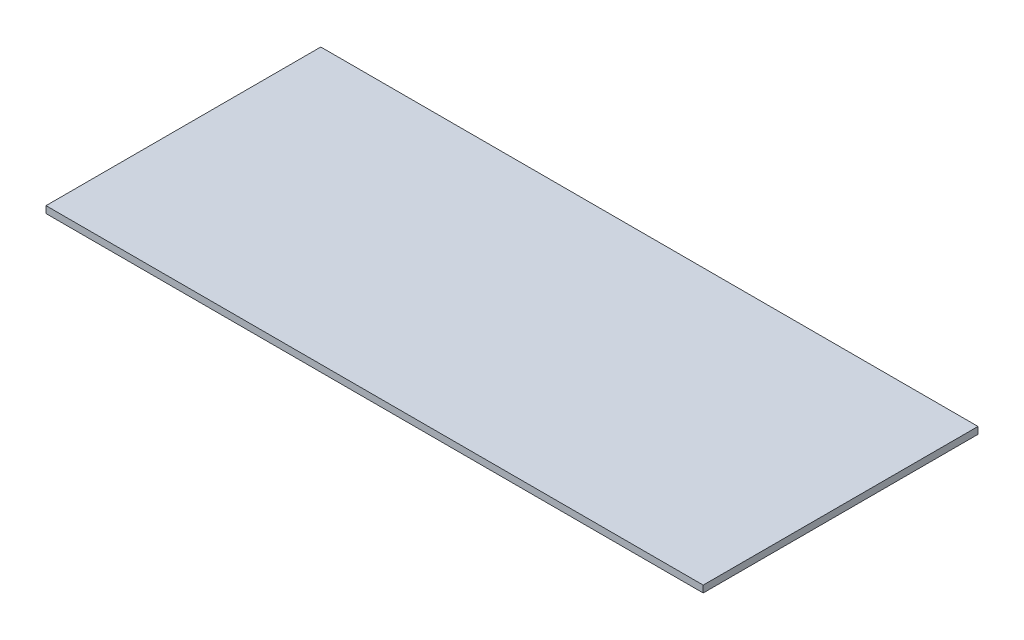
ISO-10303-21;
HEADER;
FILE_DESCRIPTION(('STEP AP214'),'2;1');
FILE_NAME('part.step','',(''),(''),'','','');
FILE_SCHEMA(('AUTOMOTIVE_DESIGN { 1 0 10303 214 1 1 1 1 }'));
ENDSEC;
DATA;
#1=APPLICATION_CONTEXT('core data for automotive mechanical design processes');
#2=APPLICATION_PROTOCOL_DEFINITION('international standard','automotive_design',2000,#1);
#3=PRODUCT_CONTEXT('',#1,'mechanical');
#4=PRODUCT('Part','Part','',(#3));
#5=PRODUCT_RELATED_PRODUCT_CATEGORY('part','',(#4));
#6=PRODUCT_DEFINITION_FORMATION('','',#4);
#7=PRODUCT_DEFINITION_CONTEXT('part definition',#1,'design');
#8=PRODUCT_DEFINITION('design','',#6,#7);
#9=PRODUCT_DEFINITION_SHAPE('','',#8);
#10=(LENGTH_UNIT() NAMED_UNIT(*) SI_UNIT(.MILLI.,.METRE.));
#11=(NAMED_UNIT(*) PLANE_ANGLE_UNIT() SI_UNIT($,.RADIAN.));
#12=(NAMED_UNIT(*) SI_UNIT($,.STERADIAN.) SOLID_ANGLE_UNIT());
#13=UNCERTAINTY_MEASURE_WITH_UNIT(LENGTH_MEASURE(1.E-05),#10,'distance_accuracy_value','');
#14=(GEOMETRIC_REPRESENTATION_CONTEXT(3) GLOBAL_UNCERTAINTY_ASSIGNED_CONTEXT((#13)) GLOBAL_UNIT_ASSIGNED_CONTEXT((#10,
#11,#12)) REPRESENTATION_CONTEXT('',''));
#15=CARTESIAN_POINT('',(0.,0.,0.));
#16=DIRECTION('',(0.,0.,1.));
#17=DIRECTION('',(1.,0.,0.));
#18=AXIS2_PLACEMENT_3D('',#15,#16,#17);
#19=CARTESIAN_POINT('',(143.5,3.,60.));
#20=DIRECTION('',(-1.,0.,0.));
#21=DIRECTION('',(0.,0.,1.));
#22=AXIS2_PLACEMENT_3D('',#19,#20,#21);
#23=PLANE('',#22);
#24=DIRECTION('',(0.,0.,-1.));
#25=VECTOR('',#24,1.);
#26=CARTESIAN_POINT('',(143.5,0.,60.));
#27=LINE('',#26,#25);
#28=CARTESIAN_POINT('',(143.5,0.,60.));
#29=VERTEX_POINT('',#28);
#30=CARTESIAN_POINT('',(143.5,0.,-60.));
#31=VERTEX_POINT('',#30);
#32=EDGE_CURVE('E99',#29,#31,#27,.T.);
#33=ORIENTED_EDGE('',*,*,#32,.T.);
#34=DIRECTION('',(0.,-1.,0.));
#35=VECTOR('',#34,1.);
#36=CARTESIAN_POINT('',(143.5,3.,-60.));
#37=LINE('',#36,#35);
#38=CARTESIAN_POINT('',(143.5,3.,-60.));
#39=VERTEX_POINT('',#38);
#40=EDGE_CURVE('E11',#39,#31,#37,.T.);
#41=ORIENTED_EDGE('',*,*,#40,.F.);
#42=DIRECTION('',(0.,0.,-1.));
#43=VECTOR('',#42,1.);
#44=CARTESIAN_POINT('',(143.5,3.,60.));
#45=LINE('',#44,#43);
#46=CARTESIAN_POINT('',(143.5,3.,60.));
#47=VERTEX_POINT('',#46);
#48=EDGE_CURVE('E87',#47,#39,#45,.T.);
#49=ORIENTED_EDGE('',*,*,#48,.F.);
#50=DIRECTION('',(0.,-1.,0.));
#51=VECTOR('',#50,1.);
#52=CARTESIAN_POINT('',(143.5,3.,60.));
#53=LINE('',#52,#51);
#54=EDGE_CURVE('E95',#47,#29,#53,.T.);
#55=ORIENTED_EDGE('',*,*,#54,.T.);
#56=EDGE_LOOP('',(#33,#41,#49,#55));
#57=FACE_BOUND('',#56,.T.);
#58=ADVANCED_FACE('F36',(#57),#23,.F.);
#59=CARTESIAN_POINT('',(-143.5,3.,-60.));
#60=DIRECTION('',(0.,0.,1.));
#61=DIRECTION('',(1.,0.,0.));
#62=AXIS2_PLACEMENT_3D('',#59,#60,#61);
#63=PLANE('',#62);
#64=DIRECTION('',(-1.,0.,0.));
#65=VECTOR('',#64,1.);
#66=CARTESIAN_POINT('',(-143.5,0.,-60.));
#67=LINE('',#66,#65);
#68=CARTESIAN_POINT('',(-143.5,0.,-60.));
#69=VERTEX_POINT('',#68);
#70=EDGE_CURVE('E91',#31,#69,#67,.T.);
#71=ORIENTED_EDGE('',*,*,#70,.T.);
#72=DIRECTION('',(0.,-1.,0.));
#73=VECTOR('',#72,1.);
#74=CARTESIAN_POINT('',(-143.5,3.,-60.));
#75=LINE('',#74,#73);
#76=CARTESIAN_POINT('',(-143.5,3.,-60.));
#77=VERTEX_POINT('',#76);
#78=EDGE_CURVE('E44',#77,#69,#75,.T.);
#79=ORIENTED_EDGE('',*,*,#78,.F.);
#80=DIRECTION('',(-1.,0.,0.));
#81=VECTOR('',#80,1.);
#82=CARTESIAN_POINT('',(-143.5,3.,-60.));
#83=LINE('',#82,#81);
#84=EDGE_CURVE('E82',#39,#77,#83,.T.);
#85=ORIENTED_EDGE('',*,*,#84,.F.);
#86=ORIENTED_EDGE('',*,*,#40,.T.);
#87=EDGE_LOOP('',(#71,#79,#85,#86));
#88=FACE_BOUND('',#87,.T.);
#89=ADVANCED_FACE('F90',(#88),#63,.F.);
#90=CARTESIAN_POINT('',(-143.5,3.,60.));
#91=DIRECTION('',(1.,0.,0.));
#92=DIRECTION('',(0.,0.,-1.));
#93=AXIS2_PLACEMENT_3D('',#90,#91,#92);
#94=PLANE('',#93);
#95=DIRECTION('',(0.,0.,1.));
#96=VECTOR('',#95,1.);
#97=CARTESIAN_POINT('',(-143.5,0.,60.));
#98=LINE('',#97,#96);
#99=CARTESIAN_POINT('',(-143.5,0.,60.));
#100=VERTEX_POINT('',#99);
#101=EDGE_CURVE('E69',#69,#100,#98,.T.);
#102=ORIENTED_EDGE('',*,*,#101,.T.);
#103=DIRECTION('',(0.,-1.,0.));
#104=VECTOR('',#103,1.);
#105=CARTESIAN_POINT('',(-143.5,3.,60.));
#106=LINE('',#105,#104);
#107=CARTESIAN_POINT('',(-143.5,3.,60.));
#108=VERTEX_POINT('',#107);
#109=EDGE_CURVE('E92',#108,#100,#106,.T.);
#110=ORIENTED_EDGE('',*,*,#109,.F.);
#111=DIRECTION('',(0.,0.,1.));
#112=VECTOR('',#111,1.);
#113=CARTESIAN_POINT('',(-143.5,3.,60.));
#114=LINE('',#113,#112);
#115=EDGE_CURVE('E85',#77,#108,#114,.T.);
#116=ORIENTED_EDGE('',*,*,#115,.F.);
#117=ORIENTED_EDGE('',*,*,#78,.T.);
#118=EDGE_LOOP('',(#102,#110,#116,#117));
#119=FACE_BOUND('',#118,.T.);
#120=ADVANCED_FACE('F93',(#119),#94,.F.);
#121=CARTESIAN_POINT('',(-143.5,3.,60.));
#122=DIRECTION('',(0.,0.,-1.));
#123=DIRECTION('',(-1.,0.,0.));
#124=AXIS2_PLACEMENT_3D('',#121,#122,#123);
#125=PLANE('',#124);
#126=DIRECTION('',(1.,0.,0.));
#127=VECTOR('',#126,1.);
#128=CARTESIAN_POINT('',(-143.5,0.,60.));
#129=LINE('',#128,#127);
#130=EDGE_CURVE('E75',#100,#29,#129,.T.);
#131=ORIENTED_EDGE('',*,*,#130,.T.);
#132=ORIENTED_EDGE('',*,*,#54,.F.);
#133=DIRECTION('',(1.,0.,0.));
#134=VECTOR('',#133,1.);
#135=CARTESIAN_POINT('',(-143.5,3.,60.));
#136=LINE('',#135,#134);
#137=EDGE_CURVE('E52',#108,#47,#136,.T.);
#138=ORIENTED_EDGE('',*,*,#137,.F.);
#139=ORIENTED_EDGE('',*,*,#109,.T.);
#140=EDGE_LOOP('',(#131,#132,#138,#139));
#141=FACE_BOUND('',#140,.T.);
#142=ADVANCED_FACE('F106',(#141),#125,.F.);
#143=CARTESIAN_POINT('',(0.,3.,0.));
#144=DIRECTION('',(0.,-1.,0.));
#145=DIRECTION('',(0.,0.,-1.));
#146=AXIS2_PLACEMENT_3D('',#143,#144,#145);
#147=PLANE('',#146);
#148=ORIENTED_EDGE('',*,*,#48,.T.);
#149=ORIENTED_EDGE('',*,*,#84,.T.);
#150=ORIENTED_EDGE('',*,*,#115,.T.);
#151=ORIENTED_EDGE('',*,*,#137,.T.);
#152=EDGE_LOOP('',(#148,#149,#150,#151));
#153=FACE_BOUND('',#152,.T.);
#154=ADVANCED_FACE('F83',(#153),#147,.F.);
#155=CARTESIAN_POINT('',(0.,0.,0.));
#156=DIRECTION('',(0.,-1.,0.));
#157=DIRECTION('',(0.,0.,-1.));
#158=AXIS2_PLACEMENT_3D('',#155,#156,#157);
#159=PLANE('',#158);
#160=ORIENTED_EDGE('',*,*,#32,.F.);
#161=ORIENTED_EDGE('',*,*,#130,.F.);
#162=ORIENTED_EDGE('',*,*,#101,.F.);
#163=ORIENTED_EDGE('',*,*,#70,.F.);
#164=EDGE_LOOP('',(#160,#161,#162,#163));
#165=FACE_BOUND('',#164,.T.);
#166=ADVANCED_FACE('F109',(#165),#159,.T.);
#167=CLOSED_SHELL('',(#58,#89,#120,#142,#154,#166));
#168=MANIFOLD_SOLID_BREP('B2',#167);
#169=ADVANCED_BREP_SHAPE_REPRESENTATION('',(#18,#168),#14);
#170=SHAPE_DEFINITION_REPRESENTATION(#9,#169);
ENDSEC;
END-ISO-10303-21;
